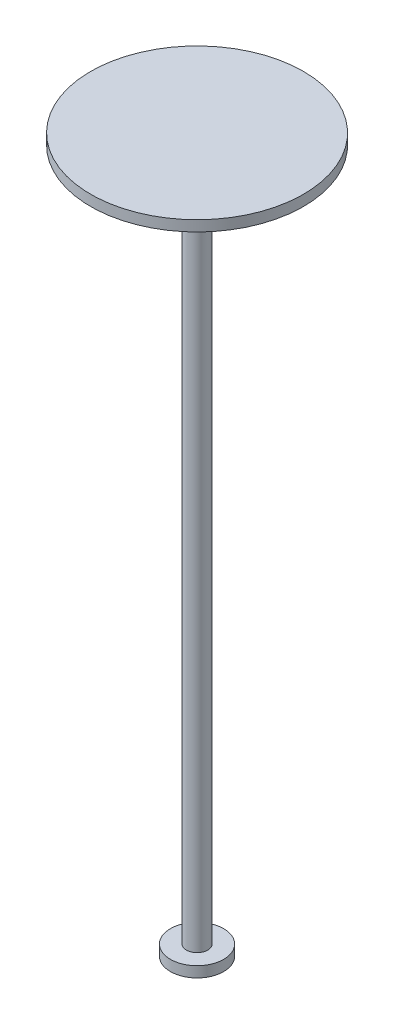
ISO-10303-21;
HEADER;
FILE_DESCRIPTION(('STEP AP214'),'2;1');
FILE_NAME('part.step','',(''),(''),'','','');
FILE_SCHEMA(('AUTOMOTIVE_DESIGN { 1 0 10303 214 1 1 1 1 }'));
ENDSEC;
DATA;
#1=APPLICATION_CONTEXT('core data for automotive mechanical design processes');
#2=APPLICATION_PROTOCOL_DEFINITION('international standard','automotive_design',2000,#1);
#3=PRODUCT_CONTEXT('',#1,'mechanical');
#4=PRODUCT('Part','Part','',(#3));
#5=PRODUCT_RELATED_PRODUCT_CATEGORY('part','',(#4));
#6=PRODUCT_DEFINITION_FORMATION('','',#4);
#7=PRODUCT_DEFINITION_CONTEXT('part definition',#1,'design');
#8=PRODUCT_DEFINITION('design','',#6,#7);
#9=PRODUCT_DEFINITION_SHAPE('','',#8);
#10=(LENGTH_UNIT() NAMED_UNIT(*) SI_UNIT(.MILLI.,.METRE.));
#11=(NAMED_UNIT(*) PLANE_ANGLE_UNIT() SI_UNIT($,.RADIAN.));
#12=(NAMED_UNIT(*) SI_UNIT($,.STERADIAN.) SOLID_ANGLE_UNIT());
#13=UNCERTAINTY_MEASURE_WITH_UNIT(LENGTH_MEASURE(1.E-05),#10,'distance_accuracy_value','');
#14=(GEOMETRIC_REPRESENTATION_CONTEXT(3) GLOBAL_UNCERTAINTY_ASSIGNED_CONTEXT((#13)) GLOBAL_UNIT_ASSIGNED_CONTEXT((#10,
#11,#12)) REPRESENTATION_CONTEXT('',''));
#15=CARTESIAN_POINT('',(0.,0.,0.));
#16=DIRECTION('',(0.,0.,1.));
#17=DIRECTION('',(1.,0.,0.));
#18=AXIS2_PLACEMENT_3D('',#15,#16,#17);
#19=CARTESIAN_POINT('',(0.,-4.93316917099467,0.));
#20=DIRECTION('',(0.,-1.,0.));
#21=DIRECTION('',(0.,0.,-1.));
#22=AXIS2_PLACEMENT_3D('',#19,#20,#21);
#23=PLANE('',#22);
#24=CARTESIAN_POINT('',(0.,-4.93316917099467,0.));
#25=DIRECTION('',(0.,-1.,0.));
#26=DIRECTION('',(0.,0.,-1.));
#27=AXIS2_PLACEMENT_3D('',#24,#25,#26);
#28=CIRCLE('',#27,6.35);
#29=CARTESIAN_POINT('',(0.,-4.93316917099467,-6.35));
#30=VERTEX_POINT('',#29);
#31=EDGE_CURVE('E10',#30,#30,#28,.T.);
#32=ORIENTED_EDGE('',*,*,#31,.T.);
#33=EDGE_LOOP('',(#32));
#34=FACE_BOUND('',#33,.T.);
#35=ADVANCED_FACE('F33',(#34),#23,.T.);
#36=CARTESIAN_POINT('',(0.,0.,0.));
#37=DIRECTION('',(0.,-1.,0.));
#38=DIRECTION('',(0.,0.,-1.));
#39=AXIS2_PLACEMENT_3D('',#36,#37,#38);
#40=CYLINDRICAL_SURFACE('',#39,6.35);
#41=CARTESIAN_POINT('',(0.,-2.39316917099467,0.));
#42=DIRECTION('',(0.,-1.,0.));
#43=DIRECTION('',(0.,0.,-1.));
#44=AXIS2_PLACEMENT_3D('',#41,#42,#43);
#45=CIRCLE('',#44,6.35);
#46=CARTESIAN_POINT('',(0.,-2.39316917099467,-6.35));
#47=VERTEX_POINT('',#46);
#48=EDGE_CURVE('E39',#47,#47,#45,.T.);
#49=ORIENTED_EDGE('',*,*,#48,.T.);
#50=EDGE_LOOP('',(#49));
#51=FACE_BOUND('',#50,.T.);
#52=ORIENTED_EDGE('',*,*,#31,.F.);
#53=EDGE_LOOP('',(#52));
#54=FACE_BOUND('',#53,.T.);
#55=ADVANCED_FACE('F71',(#51,#54),#40,.T.);
#56=CARTESIAN_POINT('',(2.54,-2.39316917099467,0.));
#57=DIRECTION('',(0.,1.,0.));
#58=DIRECTION('',(0.,0.,1.));
#59=AXIS2_PLACEMENT_3D('',#56,#57,#58);
#60=PLANE('',#59);
#61=CARTESIAN_POINT('',(0.,-2.39316917099467,0.));
#62=DIRECTION('',(0.,-1.,0.));
#63=DIRECTION('',(0.,0.,-1.));
#64=AXIS2_PLACEMENT_3D('',#61,#62,#63);
#65=CIRCLE('',#64,2.54);
#66=CARTESIAN_POINT('',(0.,-2.39316917099467,-2.54));
#67=VERTEX_POINT('',#66);
#68=EDGE_CURVE('E43',#67,#67,#65,.T.);
#69=ORIENTED_EDGE('',*,*,#68,.T.);
#70=EDGE_LOOP('',(#69));
#71=FACE_BOUND('',#70,.T.);
#72=ORIENTED_EDGE('',*,*,#48,.F.);
#73=EDGE_LOOP('',(#72));
#74=FACE_BOUND('',#73,.T.);
#75=ADVANCED_FACE('F75',(#71,#74),#60,.T.);
#76=CARTESIAN_POINT('',(0.,0.,0.));
#77=DIRECTION('',(0.,-1.,0.));
#78=DIRECTION('',(0.,0.,-1.));
#79=AXIS2_PLACEMENT_3D('',#76,#77,#78);
#80=CYLINDRICAL_SURFACE('',#79,2.54);
#81=CARTESIAN_POINT('',(0.,162.706830829005,0.));
#82=DIRECTION('',(0.,-1.,0.));
#83=DIRECTION('',(0.,0.,-1.));
#84=AXIS2_PLACEMENT_3D('',#81,#82,#83);
#85=CIRCLE('',#84,2.54);
#86=CARTESIAN_POINT('',(0.,162.706830829005,-2.54));
#87=VERTEX_POINT('',#86);
#88=EDGE_CURVE('E47',#87,#87,#85,.T.);
#89=ORIENTED_EDGE('',*,*,#88,.T.);
#90=EDGE_LOOP('',(#89));
#91=FACE_BOUND('',#90,.T.);
#92=ORIENTED_EDGE('',*,*,#68,.F.);
#93=EDGE_LOOP('',(#92));
#94=FACE_BOUND('',#93,.T.);
#95=ADVANCED_FACE('F79',(#91,#94),#80,.T.);
#96=CARTESIAN_POINT('',(2.54,162.706830829005,0.));
#97=DIRECTION('',(0.,-1.,0.));
#98=DIRECTION('',(0.,0.,-1.));
#99=AXIS2_PLACEMENT_3D('',#96,#97,#98);
#100=PLANE('',#99);
#101=CARTESIAN_POINT('',(0.,162.706830829005,0.));
#102=DIRECTION('',(0.,-1.,0.));
#103=DIRECTION('',(0.,0.,-1.));
#104=AXIS2_PLACEMENT_3D('',#101,#102,#103);
#105=CIRCLE('',#104,25.4);
#106=CARTESIAN_POINT('',(0.,162.706830829005,-25.4));
#107=VERTEX_POINT('',#106);
#108=EDGE_CURVE('E52',#107,#107,#105,.T.);
#109=ORIENTED_EDGE('',*,*,#108,.T.);
#110=EDGE_LOOP('',(#109));
#111=FACE_BOUND('',#110,.T.);
#112=ORIENTED_EDGE('',*,*,#88,.F.);
#113=EDGE_LOOP('',(#112));
#114=FACE_BOUND('',#113,.T.);
#115=ADVANCED_FACE('F68',(#111,#114),#100,.T.);
#116=CARTESIAN_POINT('',(0.,0.,0.));
#117=DIRECTION('',(0.,-1.,0.));
#118=DIRECTION('',(0.,0.,-1.));
#119=AXIS2_PLACEMENT_3D('',#116,#117,#118);
#120=CYLINDRICAL_SURFACE('',#119,25.4);
#121=CARTESIAN_POINT('',(0.,165.246830829005,0.));
#122=DIRECTION('',(0.,-1.,0.));
#123=DIRECTION('',(0.,0.,-1.));
#124=AXIS2_PLACEMENT_3D('',#121,#122,#123);
#125=CIRCLE('',#124,25.4);
#126=CARTESIAN_POINT('',(0.,165.246830829005,-25.4));
#127=VERTEX_POINT('',#126);
#128=EDGE_CURVE('E55',#127,#127,#125,.T.);
#129=ORIENTED_EDGE('',*,*,#128,.T.);
#130=EDGE_LOOP('',(#129));
#131=FACE_BOUND('',#130,.T.);
#132=ORIENTED_EDGE('',*,*,#108,.F.);
#133=EDGE_LOOP('',(#132));
#134=FACE_BOUND('',#133,.T.);
#135=ADVANCED_FACE('F59',(#131,#134),#120,.T.);
#136=CARTESIAN_POINT('',(0.,165.246830829005,0.));
#137=DIRECTION('',(0.,1.,0.));
#138=DIRECTION('',(0.,0.,1.));
#139=AXIS2_PLACEMENT_3D('',#136,#137,#138);
#140=PLANE('',#139);
#141=ORIENTED_EDGE('',*,*,#128,.F.);
#142=EDGE_LOOP('',(#141));
#143=FACE_BOUND('',#142,.T.);
#144=ADVANCED_FACE('F62',(#143),#140,.T.);
#145=CLOSED_SHELL('',(#35,#55,#75,#95,#115,#135,#144));
#146=MANIFOLD_SOLID_BREP('B2',#145);
#147=ADVANCED_BREP_SHAPE_REPRESENTATION('',(#18,#146),#14);
#148=SHAPE_DEFINITION_REPRESENTATION(#9,#147);
ENDSEC;
END-ISO-10303-21;
